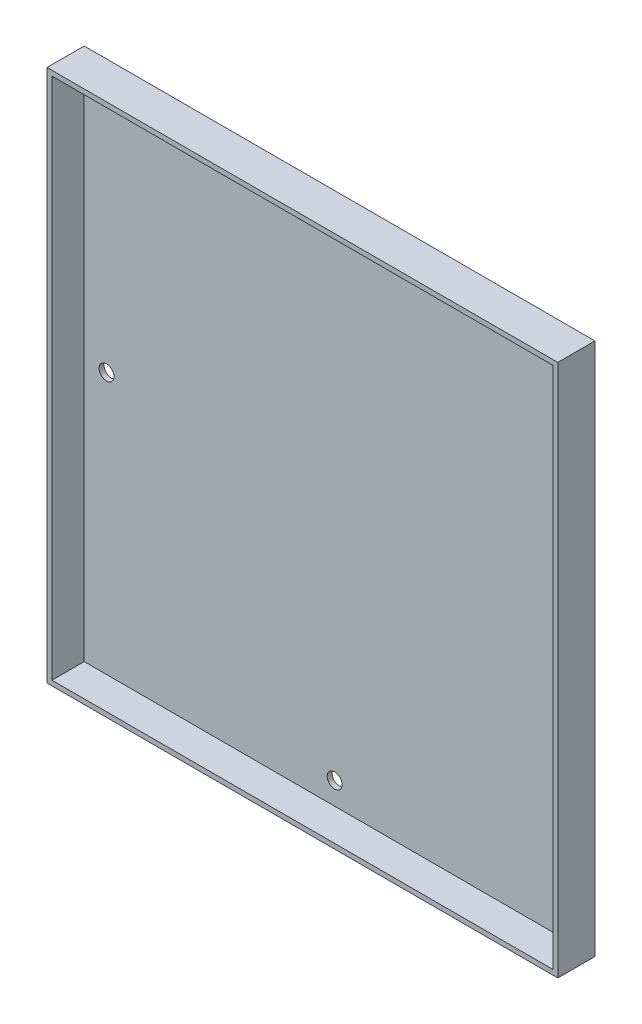
ISO-10303-21;
HEADER;
FILE_DESCRIPTION(('STEP AP214'),'2;1');
FILE_NAME('part.step','',(''),(''),'','','');
FILE_SCHEMA(('AUTOMOTIVE_DESIGN { 1 0 10303 214 1 1 1 1 }'));
ENDSEC;
DATA;
#1=APPLICATION_CONTEXT('core data for automotive mechanical design processes');
#2=APPLICATION_PROTOCOL_DEFINITION('international standard','automotive_design',2000,#1);
#3=PRODUCT_CONTEXT('',#1,'mechanical');
#4=PRODUCT('Part','Part','',(#3));
#5=PRODUCT_RELATED_PRODUCT_CATEGORY('part','',(#4));
#6=PRODUCT_DEFINITION_FORMATION('','',#4);
#7=PRODUCT_DEFINITION_CONTEXT('part definition',#1,'design');
#8=PRODUCT_DEFINITION('design','',#6,#7);
#9=PRODUCT_DEFINITION_SHAPE('','',#8);
#10=(LENGTH_UNIT() NAMED_UNIT(*) SI_UNIT(.MILLI.,.METRE.));
#11=(NAMED_UNIT(*) PLANE_ANGLE_UNIT() SI_UNIT($,.RADIAN.));
#12=(NAMED_UNIT(*) SI_UNIT($,.STERADIAN.) SOLID_ANGLE_UNIT());
#13=UNCERTAINTY_MEASURE_WITH_UNIT(LENGTH_MEASURE(1.E-05),#10,'distance_accuracy_value','');
#14=(GEOMETRIC_REPRESENTATION_CONTEXT(3) GLOBAL_UNCERTAINTY_ASSIGNED_CONTEXT((#13)) GLOBAL_UNIT_ASSIGNED_CONTEXT((#10,
#11,#12)) REPRESENTATION_CONTEXT('',''));
#15=CARTESIAN_POINT('',(0.,0.,0.));
#16=DIRECTION('',(0.,0.,1.));
#17=DIRECTION('',(1.,0.,0.));
#18=AXIS2_PLACEMENT_3D('',#15,#16,#17);
#19=CARTESIAN_POINT('',(103.,107.5,15.));
#20=DIRECTION('',(-1.,0.,0.));
#21=DIRECTION('',(0.,0.,1.));
#22=AXIS2_PLACEMENT_3D('',#19,#20,#21);
#23=PLANE('',#22);
#24=DIRECTION('',(0.,1.,0.));
#25=VECTOR('',#24,1.);
#26=CARTESIAN_POINT('',(103.,107.5,0.));
#27=LINE('',#26,#25);
#28=CARTESIAN_POINT('',(103.,-107.5,0.));
#29=VERTEX_POINT('',#28);
#30=CARTESIAN_POINT('',(103.,107.5,0.));
#31=VERTEX_POINT('',#30);
#32=EDGE_CURVE('E149',#29,#31,#27,.T.);
#33=ORIENTED_EDGE('',*,*,#32,.T.);
#34=DIRECTION('',(0.,0.,-1.));
#35=VECTOR('',#34,1.);
#36=CARTESIAN_POINT('',(103.,107.5,15.));
#37=LINE('',#36,#35);
#38=CARTESIAN_POINT('',(103.,107.5,15.));
#39=VERTEX_POINT('',#38);
#40=EDGE_CURVE('E11',#39,#31,#37,.T.);
#41=ORIENTED_EDGE('',*,*,#40,.F.);
#42=DIRECTION('',(0.,1.,0.));
#43=VECTOR('',#42,1.);
#44=CARTESIAN_POINT('',(103.,107.5,15.));
#45=LINE('',#44,#43);
#46=CARTESIAN_POINT('',(103.,-107.5,15.));
#47=VERTEX_POINT('',#46);
#48=EDGE_CURVE('E142',#47,#39,#45,.T.);
#49=ORIENTED_EDGE('',*,*,#48,.F.);
#50=DIRECTION('',(0.,0.,-1.));
#51=VECTOR('',#50,1.);
#52=CARTESIAN_POINT('',(103.,-107.5,15.));
#53=LINE('',#52,#51);
#54=EDGE_CURVE('E148',#47,#29,#53,.T.);
#55=ORIENTED_EDGE('',*,*,#54,.T.);
#56=EDGE_LOOP('',(#33,#41,#49,#55));
#57=FACE_BOUND('',#56,.T.);
#58=ADVANCED_FACE('F35',(#57),#23,.F.);
#59=CARTESIAN_POINT('',(-103.,107.5,15.));
#60=DIRECTION('',(0.,-1.,0.));
#61=DIRECTION('',(0.,0.,-1.));
#62=AXIS2_PLACEMENT_3D('',#59,#60,#61);
#63=PLANE('',#62);
#64=DIRECTION('',(-1.,0.,0.));
#65=VECTOR('',#64,1.);
#66=CARTESIAN_POINT('',(-103.,107.5,0.));
#67=LINE('',#66,#65);
#68=CARTESIAN_POINT('',(-103.,107.5,0.));
#69=VERTEX_POINT('',#68);
#70=EDGE_CURVE('E152',#31,#69,#67,.T.);
#71=ORIENTED_EDGE('',*,*,#70,.T.);
#72=DIRECTION('',(0.,0.,-1.));
#73=VECTOR('',#72,1.);
#74=CARTESIAN_POINT('',(-103.,107.5,15.));
#75=LINE('',#74,#73);
#76=CARTESIAN_POINT('',(-103.,107.5,15.));
#77=VERTEX_POINT('',#76);
#78=EDGE_CURVE('E42',#77,#69,#75,.T.);
#79=ORIENTED_EDGE('',*,*,#78,.F.);
#80=DIRECTION('',(-1.,0.,0.));
#81=VECTOR('',#80,1.);
#82=CARTESIAN_POINT('',(-103.,107.5,15.));
#83=LINE('',#82,#81);
#84=EDGE_CURVE('E86',#39,#77,#83,.T.);
#85=ORIENTED_EDGE('',*,*,#84,.F.);
#86=ORIENTED_EDGE('',*,*,#40,.T.);
#87=EDGE_LOOP('',(#71,#79,#85,#86));
#88=FACE_BOUND('',#87,.T.);
#89=ADVANCED_FACE('F181',(#88),#63,.F.);
#90=CARTESIAN_POINT('',(-103.,107.5,15.));
#91=DIRECTION('',(1.,0.,0.));
#92=DIRECTION('',(0.,0.,-1.));
#93=AXIS2_PLACEMENT_3D('',#90,#91,#92);
#94=PLANE('',#93);
#95=DIRECTION('',(0.,-1.,0.));
#96=VECTOR('',#95,1.);
#97=CARTESIAN_POINT('',(-103.,107.5,0.));
#98=LINE('',#97,#96);
#99=CARTESIAN_POINT('',(-103.,-107.5,0.));
#100=VERTEX_POINT('',#99);
#101=EDGE_CURVE('E154',#69,#100,#98,.T.);
#102=ORIENTED_EDGE('',*,*,#101,.T.);
#103=DIRECTION('',(0.,0.,-1.));
#104=VECTOR('',#103,1.);
#105=CARTESIAN_POINT('',(-103.,-107.5,15.));
#106=LINE('',#105,#104);
#107=CARTESIAN_POINT('',(-103.,-107.5,15.));
#108=VERTEX_POINT('',#107);
#109=EDGE_CURVE('E158',#108,#100,#106,.T.);
#110=ORIENTED_EDGE('',*,*,#109,.F.);
#111=DIRECTION('',(0.,-1.,0.));
#112=VECTOR('',#111,1.);
#113=CARTESIAN_POINT('',(-103.,107.5,15.));
#114=LINE('',#113,#112);
#115=EDGE_CURVE('E145',#77,#108,#114,.T.);
#116=ORIENTED_EDGE('',*,*,#115,.F.);
#117=ORIENTED_EDGE('',*,*,#78,.T.);
#118=EDGE_LOOP('',(#102,#110,#116,#117));
#119=FACE_BOUND('',#118,.T.);
#120=ADVANCED_FACE('F163',(#119),#94,.F.);
#121=CARTESIAN_POINT('',(-103.,-107.5,15.));
#122=DIRECTION('',(0.,1.,0.));
#123=DIRECTION('',(0.,0.,1.));
#124=AXIS2_PLACEMENT_3D('',#121,#122,#123);
#125=PLANE('',#124);
#126=DIRECTION('',(1.,0.,0.));
#127=VECTOR('',#126,1.);
#128=CARTESIAN_POINT('',(-103.,-107.5,0.));
#129=LINE('',#128,#127);
#130=EDGE_CURVE('E79',#100,#29,#129,.T.);
#131=ORIENTED_EDGE('',*,*,#130,.T.);
#132=ORIENTED_EDGE('',*,*,#54,.F.);
#133=DIRECTION('',(1.,0.,0.));
#134=VECTOR('',#133,1.);
#135=CARTESIAN_POINT('',(-103.,-107.5,15.));
#136=LINE('',#135,#134);
#137=EDGE_CURVE('E58',#108,#47,#136,.T.);
#138=ORIENTED_EDGE('',*,*,#137,.F.);
#139=ORIENTED_EDGE('',*,*,#109,.T.);
#140=EDGE_LOOP('',(#131,#132,#138,#139));
#141=FACE_BOUND('',#140,.T.);
#142=ADVANCED_FACE('F171',(#141),#125,.F.);
#143=CARTESIAN_POINT('',(0.,0.,15.));
#144=DIRECTION('',(0.,0.,1.));
#145=DIRECTION('',(1.,0.,0.));
#146=AXIS2_PLACEMENT_3D('',#143,#144,#145);
#147=PLANE('',#146);
#148=DIRECTION('',(0.,1.,0.));
#149=VECTOR('',#148,1.);
#150=CARTESIAN_POINT('',(101.,107.5,15.));
#151=LINE('',#150,#149);
#152=CARTESIAN_POINT('',(101.,-105.5,15.));
#153=VERTEX_POINT('',#152);
#154=CARTESIAN_POINT('',(101.,105.5,15.));
#155=VERTEX_POINT('',#154);
#156=EDGE_CURVE('E131',#153,#155,#151,.T.);
#157=ORIENTED_EDGE('',*,*,#156,.F.);
#158=DIRECTION('',(1.,0.,0.));
#159=VECTOR('',#158,1.);
#160=CARTESIAN_POINT('',(-103.,-105.5,15.));
#161=LINE('',#160,#159);
#162=CARTESIAN_POINT('',(-101.,-105.5,15.));
#163=VERTEX_POINT('',#162);
#164=EDGE_CURVE('E140',#163,#153,#161,.T.);
#165=ORIENTED_EDGE('',*,*,#164,.F.);
#166=DIRECTION('',(0.,-1.,0.));
#167=VECTOR('',#166,1.);
#168=CARTESIAN_POINT('',(-101.,107.5,15.));
#169=LINE('',#168,#167);
#170=CARTESIAN_POINT('',(-101.,105.5,15.));
#171=VERTEX_POINT('',#170);
#172=EDGE_CURVE('E138',#171,#163,#169,.T.);
#173=ORIENTED_EDGE('',*,*,#172,.F.);
#174=DIRECTION('',(-1.,0.,0.));
#175=VECTOR('',#174,1.);
#176=CARTESIAN_POINT('',(-103.,105.5,15.));
#177=LINE('',#176,#175);
#178=EDGE_CURVE('E123',#155,#171,#177,.T.);
#179=ORIENTED_EDGE('',*,*,#178,.F.);
#180=EDGE_LOOP('',(#157,#165,#173,#179));
#181=FACE_BOUND('',#180,.T.);
#182=ORIENTED_EDGE('',*,*,#48,.T.);
#183=ORIENTED_EDGE('',*,*,#84,.T.);
#184=ORIENTED_EDGE('',*,*,#115,.T.);
#185=ORIENTED_EDGE('',*,*,#137,.T.);
#186=EDGE_LOOP('',(#182,#183,#184,#185));
#187=FACE_BOUND('',#186,.T.);
#188=ADVANCED_FACE('F173',(#181,#187),#147,.T.);
#189=CARTESIAN_POINT('',(0.,0.,0.));
#190=DIRECTION('',(0.,0.,1.));
#191=DIRECTION('',(1.,0.,0.));
#192=AXIS2_PLACEMENT_3D('',#189,#190,#191);
#193=PLANE('',#192);
#194=CARTESIAN_POINT('',(-92.,0.,0.));
#195=DIRECTION('',(0.,0.,1.));
#196=DIRECTION('',(1.,0.,0.));
#197=AXIS2_PLACEMENT_3D('',#194,#195,#196);
#198=CIRCLE('',#197,3.00000000000001);
#199=CARTESIAN_POINT('',(-89.,0.,0.));
#200=VERTEX_POINT('',#199);
#201=EDGE_CURVE('E306',#200,#200,#198,.T.);
#202=ORIENTED_EDGE('',*,*,#201,.T.);
#203=EDGE_LOOP('',(#202));
#204=FACE_BOUND('',#203,.T.);
#205=CARTESIAN_POINT('',(0.,96.5,0.));
#206=DIRECTION('',(0.,0.,1.));
#207=DIRECTION('',(1.,0.,0.));
#208=AXIS2_PLACEMENT_3D('',#205,#206,#207);
#209=CIRCLE('',#208,3.);
#210=CARTESIAN_POINT('',(3.,96.5,0.));
#211=VERTEX_POINT('',#210);
#212=EDGE_CURVE('E307',#211,#211,#209,.T.);
#213=ORIENTED_EDGE('',*,*,#212,.T.);
#214=EDGE_LOOP('',(#213));
#215=FACE_BOUND('',#214,.T.);
#216=CARTESIAN_POINT('',(92.,0.,0.));
#217=DIRECTION('',(0.,0.,1.));
#218=DIRECTION('',(1.,0.,0.));
#219=AXIS2_PLACEMENT_3D('',#216,#217,#218);
#220=CIRCLE('',#219,3.00000000000001);
#221=CARTESIAN_POINT('',(95.,0.,0.));
#222=VERTEX_POINT('',#221);
#223=EDGE_CURVE('E311',#222,#222,#220,.T.);
#224=ORIENTED_EDGE('',*,*,#223,.T.);
#225=EDGE_LOOP('',(#224));
#226=FACE_BOUND('',#225,.T.);
#227=CARTESIAN_POINT('',(0.,-96.5,0.));
#228=DIRECTION('',(0.,0.,1.));
#229=DIRECTION('',(1.,0.,0.));
#230=AXIS2_PLACEMENT_3D('',#227,#228,#229);
#231=CIRCLE('',#230,3.);
#232=CARTESIAN_POINT('',(3.,-96.5,0.));
#233=VERTEX_POINT('',#232);
#234=EDGE_CURVE('E322',#233,#233,#231,.T.);
#235=ORIENTED_EDGE('',*,*,#234,.T.);
#236=EDGE_LOOP('',(#235));
#237=FACE_BOUND('',#236,.T.);
#238=ORIENTED_EDGE('',*,*,#32,.F.);
#239=ORIENTED_EDGE('',*,*,#130,.F.);
#240=ORIENTED_EDGE('',*,*,#101,.F.);
#241=ORIENTED_EDGE('',*,*,#70,.F.);
#242=EDGE_LOOP('',(#238,#239,#240,#241));
#243=FACE_BOUND('',#242,.T.);
#244=ADVANCED_FACE('F167',(#204,#215,#226,#237,#243),#193,.F.);
#245=CARTESIAN_POINT('',(101.,107.5,15.));
#246=DIRECTION('',(-1.,0.,0.));
#247=DIRECTION('',(0.,0.,1.));
#248=AXIS2_PLACEMENT_3D('',#245,#246,#247);
#249=PLANE('',#248);
#250=DIRECTION('',(0.,1.,0.));
#251=VECTOR('',#250,1.);
#252=CARTESIAN_POINT('',(101.,107.5,2.));
#253=LINE('',#252,#251);
#254=CARTESIAN_POINT('',(101.,-105.5,2.));
#255=VERTEX_POINT('',#254);
#256=CARTESIAN_POINT('',(101.,105.5,2.));
#257=VERTEX_POINT('',#256);
#258=EDGE_CURVE('E114',#255,#257,#253,.T.);
#259=ORIENTED_EDGE('',*,*,#258,.F.);
#260=DIRECTION('',(0.,0.,-1.));
#261=VECTOR('',#260,1.);
#262=CARTESIAN_POINT('',(101.,-105.5,15.));
#263=LINE('',#262,#261);
#264=EDGE_CURVE('E134',#153,#255,#263,.T.);
#265=ORIENTED_EDGE('',*,*,#264,.F.);
#266=ORIENTED_EDGE('',*,*,#156,.T.);
#267=DIRECTION('',(0.,0.,-1.));
#268=VECTOR('',#267,1.);
#269=CARTESIAN_POINT('',(101.,105.5,15.));
#270=LINE('',#269,#268);
#271=EDGE_CURVE('E126',#155,#257,#270,.T.);
#272=ORIENTED_EDGE('',*,*,#271,.T.);
#273=EDGE_LOOP('',(#259,#265,#266,#272));
#274=FACE_BOUND('',#273,.T.);
#275=ADVANCED_FACE('F211',(#274),#249,.T.);
#276=CARTESIAN_POINT('',(-103.,105.5,15.));
#277=DIRECTION('',(0.,-1.,0.));
#278=DIRECTION('',(0.,0.,-1.));
#279=AXIS2_PLACEMENT_3D('',#276,#277,#278);
#280=PLANE('',#279);
#281=DIRECTION('',(-1.,0.,0.));
#282=VECTOR('',#281,1.);
#283=CARTESIAN_POINT('',(-103.,105.5,2.));
#284=LINE('',#283,#282);
#285=CARTESIAN_POINT('',(-101.,105.5,2.));
#286=VERTEX_POINT('',#285);
#287=EDGE_CURVE('E108',#257,#286,#284,.T.);
#288=ORIENTED_EDGE('',*,*,#287,.F.);
#289=ORIENTED_EDGE('',*,*,#271,.F.);
#290=ORIENTED_EDGE('',*,*,#178,.T.);
#291=DIRECTION('',(0.,0.,-1.));
#292=VECTOR('',#291,1.);
#293=CARTESIAN_POINT('',(-101.,105.5,15.));
#294=LINE('',#293,#292);
#295=EDGE_CURVE('E120',#171,#286,#294,.T.);
#296=ORIENTED_EDGE('',*,*,#295,.T.);
#297=EDGE_LOOP('',(#288,#289,#290,#296));
#298=FACE_BOUND('',#297,.T.);
#299=ADVANCED_FACE('F121',(#298),#280,.T.);
#300=CARTESIAN_POINT('',(-101.,107.5,15.));
#301=DIRECTION('',(1.,0.,0.));
#302=DIRECTION('',(0.,0.,-1.));
#303=AXIS2_PLACEMENT_3D('',#300,#301,#302);
#304=PLANE('',#303);
#305=DIRECTION('',(0.,-1.,0.));
#306=VECTOR('',#305,1.);
#307=CARTESIAN_POINT('',(-101.,107.5,2.));
#308=LINE('',#307,#306);
#309=CARTESIAN_POINT('',(-101.,-105.5,2.));
#310=VERTEX_POINT('',#309);
#311=EDGE_CURVE('E112',#286,#310,#308,.T.);
#312=ORIENTED_EDGE('',*,*,#311,.F.);
#313=ORIENTED_EDGE('',*,*,#295,.F.);
#314=ORIENTED_EDGE('',*,*,#172,.T.);
#315=DIRECTION('',(0.,0.,-1.));
#316=VECTOR('',#315,1.);
#317=CARTESIAN_POINT('',(-101.,-105.5,15.));
#318=LINE('',#317,#316);
#319=EDGE_CURVE('E49',#163,#310,#318,.T.);
#320=ORIENTED_EDGE('',*,*,#319,.T.);
#321=EDGE_LOOP('',(#312,#313,#314,#320));
#322=FACE_BOUND('',#321,.T.);
#323=ADVANCED_FACE('F128',(#322),#304,.T.);
#324=CARTESIAN_POINT('',(-103.,-105.5,15.));
#325=DIRECTION('',(0.,1.,0.));
#326=DIRECTION('',(0.,0.,1.));
#327=AXIS2_PLACEMENT_3D('',#324,#325,#326);
#328=PLANE('',#327);
#329=DIRECTION('',(1.,0.,0.));
#330=VECTOR('',#329,1.);
#331=CARTESIAN_POINT('',(-103.,-105.5,2.));
#332=LINE('',#331,#330);
#333=EDGE_CURVE('E129',#310,#255,#332,.T.);
#334=ORIENTED_EDGE('',*,*,#333,.F.);
#335=ORIENTED_EDGE('',*,*,#319,.F.);
#336=ORIENTED_EDGE('',*,*,#164,.T.);
#337=ORIENTED_EDGE('',*,*,#264,.T.);
#338=EDGE_LOOP('',(#334,#335,#336,#337));
#339=FACE_BOUND('',#338,.T.);
#340=ADVANCED_FACE('F233',(#339),#328,.T.);
#341=CARTESIAN_POINT('',(0.,0.,2.));
#342=DIRECTION('',(0.,0.,1.));
#343=DIRECTION('',(1.,0.,0.));
#344=AXIS2_PLACEMENT_3D('',#341,#342,#343);
#345=PLANE('',#344);
#346=CARTESIAN_POINT('',(-92.,0.,2.));
#347=DIRECTION('',(0.,0.,1.));
#348=DIRECTION('',(1.,0.,0.));
#349=AXIS2_PLACEMENT_3D('',#346,#347,#348);
#350=CIRCLE('',#349,3.00000000000001);
#351=CARTESIAN_POINT('',(-89.,0.,2.));
#352=VERTEX_POINT('',#351);
#353=EDGE_CURVE('E303',#352,#352,#350,.T.);
#354=ORIENTED_EDGE('',*,*,#353,.F.);
#355=EDGE_LOOP('',(#354));
#356=FACE_BOUND('',#355,.T.);
#357=CARTESIAN_POINT('',(0.,96.5,2.));
#358=DIRECTION('',(0.,0.,1.));
#359=DIRECTION('',(1.,0.,0.));
#360=AXIS2_PLACEMENT_3D('',#357,#358,#359);
#361=CIRCLE('',#360,3.);
#362=CARTESIAN_POINT('',(3.,96.5,2.));
#363=VERTEX_POINT('',#362);
#364=EDGE_CURVE('E331',#363,#363,#361,.T.);
#365=ORIENTED_EDGE('',*,*,#364,.F.);
#366=EDGE_LOOP('',(#365));
#367=FACE_BOUND('',#366,.T.);
#368=CARTESIAN_POINT('',(92.,0.,2.));
#369=DIRECTION('',(0.,0.,1.));
#370=DIRECTION('',(-1.,0.,0.));
#371=AXIS2_PLACEMENT_3D('',#368,#369,#370);
#372=CIRCLE('',#371,3.00000000000001);
#373=CARTESIAN_POINT('',(89.,0.,2.));
#374=VERTEX_POINT('',#373);
#375=EDGE_CURVE('E328',#374,#374,#372,.T.);
#376=ORIENTED_EDGE('',*,*,#375,.F.);
#377=EDGE_LOOP('',(#376));
#378=FACE_BOUND('',#377,.T.);
#379=CARTESIAN_POINT('',(0.,-96.5,2.));
#380=DIRECTION('',(0.,0.,1.));
#381=DIRECTION('',(-1.,0.,0.));
#382=AXIS2_PLACEMENT_3D('',#379,#380,#381);
#383=CIRCLE('',#382,3.);
#384=CARTESIAN_POINT('',(-3.,-96.5,2.));
#385=VERTEX_POINT('',#384);
#386=EDGE_CURVE('E325',#385,#385,#383,.T.);
#387=ORIENTED_EDGE('',*,*,#386,.F.);
#388=EDGE_LOOP('',(#387));
#389=FACE_BOUND('',#388,.T.);
#390=ORIENTED_EDGE('',*,*,#258,.T.);
#391=ORIENTED_EDGE('',*,*,#287,.T.);
#392=ORIENTED_EDGE('',*,*,#311,.T.);
#393=ORIENTED_EDGE('',*,*,#333,.T.);
#394=EDGE_LOOP('',(#390,#391,#392,#393));
#395=FACE_BOUND('',#394,.T.);
#396=ADVANCED_FACE('F110',(#356,#367,#378,#389,#395),#345,.T.);
#397=CARTESIAN_POINT('',(0.,-96.5,-13.));
#398=DIRECTION('',(0.,0.,1.));
#399=DIRECTION('',(1.,0.,0.));
#400=AXIS2_PLACEMENT_3D('',#397,#398,#399);
#401=CYLINDRICAL_SURFACE('',#400,3.);
#402=ORIENTED_EDGE('',*,*,#386,.T.);
#403=EDGE_LOOP('',(#402));
#404=FACE_BOUND('',#403,.T.);
#405=ORIENTED_EDGE('',*,*,#234,.F.);
#406=EDGE_LOOP('',(#405));
#407=FACE_BOUND('',#406,.T.);
#408=ADVANCED_FACE('F256',(#404,#407),#401,.F.);
#409=CARTESIAN_POINT('',(92.,0.,-13.));
#410=DIRECTION('',(0.,0.,1.));
#411=DIRECTION('',(1.,0.,0.));
#412=AXIS2_PLACEMENT_3D('',#409,#410,#411);
#413=CYLINDRICAL_SURFACE('',#412,3.00000000000001);
#414=ORIENTED_EDGE('',*,*,#375,.T.);
#415=EDGE_LOOP('',(#414));
#416=FACE_BOUND('',#415,.T.);
#417=ORIENTED_EDGE('',*,*,#223,.F.);
#418=EDGE_LOOP('',(#417));
#419=FACE_BOUND('',#418,.T.);
#420=ADVANCED_FACE('F266',(#416,#419),#413,.F.);
#421=CARTESIAN_POINT('',(0.,96.5,-13.));
#422=DIRECTION('',(0.,0.,1.));
#423=DIRECTION('',(1.,0.,0.));
#424=AXIS2_PLACEMENT_3D('',#421,#422,#423);
#425=CYLINDRICAL_SURFACE('',#424,3.);
#426=ORIENTED_EDGE('',*,*,#364,.T.);
#427=EDGE_LOOP('',(#426));
#428=FACE_BOUND('',#427,.T.);
#429=ORIENTED_EDGE('',*,*,#212,.F.);
#430=EDGE_LOOP('',(#429));
#431=FACE_BOUND('',#430,.T.);
#432=ADVANCED_FACE('F276',(#428,#431),#425,.F.);
#433=CARTESIAN_POINT('',(-92.,0.,-13.));
#434=DIRECTION('',(0.,0.,1.));
#435=DIRECTION('',(1.,0.,0.));
#436=AXIS2_PLACEMENT_3D('',#433,#434,#435);
#437=CYLINDRICAL_SURFACE('',#436,3.00000000000001);
#438=ORIENTED_EDGE('',*,*,#353,.T.);
#439=EDGE_LOOP('',(#438));
#440=FACE_BOUND('',#439,.T.);
#441=ORIENTED_EDGE('',*,*,#201,.F.);
#442=EDGE_LOOP('',(#441));
#443=FACE_BOUND('',#442,.T.);
#444=ADVANCED_FACE('F286',(#440,#443),#437,.F.);
#445=CLOSED_SHELL('',(#58,#89,#120,#142,#188,#244,#275,#299,#323,#340,#396,#408,#420,#432,#444));
#446=MANIFOLD_SOLID_BREP('B2',#445);
#447=ADVANCED_BREP_SHAPE_REPRESENTATION('',(#18,#446),#14);
#448=SHAPE_DEFINITION_REPRESENTATION(#9,#447);
ENDSEC;
END-ISO-10303-21;
